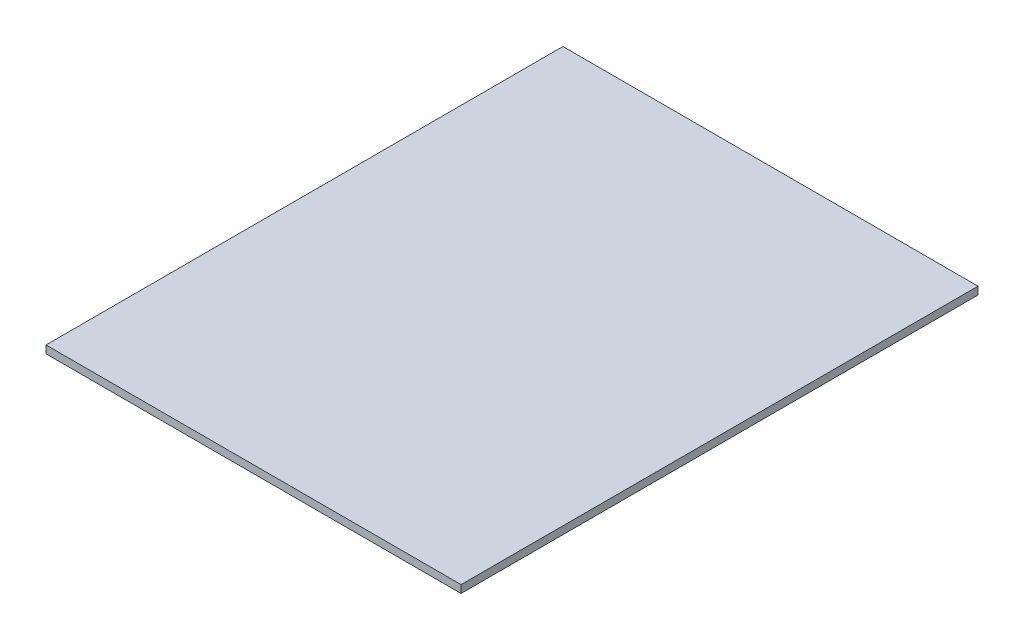
ISO-10303-21;
HEADER;
FILE_DESCRIPTION(('STEP AP214'),'2;1');
FILE_NAME('part.step','',(''),(''),'','','');
FILE_SCHEMA(('AUTOMOTIVE_DESIGN { 1 0 10303 214 1 1 1 1 }'));
ENDSEC;
DATA;
#1=APPLICATION_CONTEXT('core data for automotive mechanical design processes');
#2=APPLICATION_PROTOCOL_DEFINITION('international standard','automotive_design',2000,#1);
#3=PRODUCT_CONTEXT('',#1,'mechanical');
#4=PRODUCT('Part','Part','',(#3));
#5=PRODUCT_RELATED_PRODUCT_CATEGORY('part','',(#4));
#6=PRODUCT_DEFINITION_FORMATION('','',#4);
#7=PRODUCT_DEFINITION_CONTEXT('part definition',#1,'design');
#8=PRODUCT_DEFINITION('design','',#6,#7);
#9=PRODUCT_DEFINITION_SHAPE('','',#8);
#10=(LENGTH_UNIT() NAMED_UNIT(*) SI_UNIT(.MILLI.,.METRE.));
#11=(NAMED_UNIT(*) PLANE_ANGLE_UNIT() SI_UNIT($,.RADIAN.));
#12=(NAMED_UNIT(*) SI_UNIT($,.STERADIAN.) SOLID_ANGLE_UNIT());
#13=UNCERTAINTY_MEASURE_WITH_UNIT(LENGTH_MEASURE(1.E-05),#10,'distance_accuracy_value','');
#14=(GEOMETRIC_REPRESENTATION_CONTEXT(3) GLOBAL_UNCERTAINTY_ASSIGNED_CONTEXT((#13)) GLOBAL_UNIT_ASSIGNED_CONTEXT((#10,
#11,#12)) REPRESENTATION_CONTEXT('',''));
#15=CARTESIAN_POINT('',(0.,0.,0.));
#16=DIRECTION('',(0.,0.,1.));
#17=DIRECTION('',(1.,0.,0.));
#18=AXIS2_PLACEMENT_3D('',#15,#16,#17);
#19=CARTESIAN_POINT('',(0.,1.74,0.));
#20=DIRECTION('',(1.,0.,0.));
#21=DIRECTION('',(0.,0.,-1.));
#22=AXIS2_PLACEMENT_3D('',#19,#20,#21);
#23=PLANE('',#22);
#24=DIRECTION('',(0.,0.,1.));
#25=VECTOR('',#24,1.);
#26=CARTESIAN_POINT('',(0.,0.,0.));
#27=LINE('',#26,#25);
#28=CARTESIAN_POINT('',(0.,0.,-117.));
#29=VERTEX_POINT('',#28);
#30=CARTESIAN_POINT('',(0.,0.,0.));
#31=VERTEX_POINT('',#30);
#32=EDGE_CURVE('E98',#29,#31,#27,.T.);
#33=ORIENTED_EDGE('',*,*,#32,.T.);
#34=DIRECTION('',(0.,-1.,0.));
#35=VECTOR('',#34,1.);
#36=CARTESIAN_POINT('',(0.,1.74,0.));
#37=LINE('',#36,#35);
#38=CARTESIAN_POINT('',(0.,1.74,0.));
#39=VERTEX_POINT('',#38);
#40=EDGE_CURVE('E11',#39,#31,#37,.T.);
#41=ORIENTED_EDGE('',*,*,#40,.F.);
#42=DIRECTION('',(0.,0.,1.));
#43=VECTOR('',#42,1.);
#44=CARTESIAN_POINT('',(0.,1.74,0.));
#45=LINE('',#44,#43);
#46=CARTESIAN_POINT('',(0.,1.74,-117.));
#47=VERTEX_POINT('',#46);
#48=EDGE_CURVE('E86',#47,#39,#45,.T.);
#49=ORIENTED_EDGE('',*,*,#48,.F.);
#50=DIRECTION('',(0.,-1.,0.));
#51=VECTOR('',#50,1.);
#52=CARTESIAN_POINT('',(0.,1.74,-117.));
#53=LINE('',#52,#51);
#54=EDGE_CURVE('E94',#47,#29,#53,.T.);
#55=ORIENTED_EDGE('',*,*,#54,.T.);
#56=EDGE_LOOP('',(#33,#41,#49,#55));
#57=FACE_BOUND('',#56,.T.);
#58=ADVANCED_FACE('F35',(#57),#23,.F.);
#59=CARTESIAN_POINT('',(0.,1.74,0.));
#60=DIRECTION('',(0.,0.,-1.));
#61=DIRECTION('',(-1.,0.,0.));
#62=AXIS2_PLACEMENT_3D('',#59,#60,#61);
#63=PLANE('',#62);
#64=DIRECTION('',(1.,0.,0.));
#65=VECTOR('',#64,1.);
#66=CARTESIAN_POINT('',(0.,0.,0.));
#67=LINE('',#66,#65);
#68=CARTESIAN_POINT('',(93.95,0.,0.));
#69=VERTEX_POINT('',#68);
#70=EDGE_CURVE('E90',#31,#69,#67,.T.);
#71=ORIENTED_EDGE('',*,*,#70,.T.);
#72=DIRECTION('',(0.,-1.,0.));
#73=VECTOR('',#72,1.);
#74=CARTESIAN_POINT('',(93.95,1.74,0.));
#75=LINE('',#74,#73);
#76=CARTESIAN_POINT('',(93.95,1.74,0.));
#77=VERTEX_POINT('',#76);
#78=EDGE_CURVE('E43',#77,#69,#75,.T.);
#79=ORIENTED_EDGE('',*,*,#78,.F.);
#80=DIRECTION('',(1.,0.,0.));
#81=VECTOR('',#80,1.);
#82=CARTESIAN_POINT('',(0.,1.74,0.));
#83=LINE('',#82,#81);
#84=EDGE_CURVE('E81',#39,#77,#83,.T.);
#85=ORIENTED_EDGE('',*,*,#84,.F.);
#86=ORIENTED_EDGE('',*,*,#40,.T.);
#87=EDGE_LOOP('',(#71,#79,#85,#86));
#88=FACE_BOUND('',#87,.T.);
#89=ADVANCED_FACE('F89',(#88),#63,.F.);
#90=CARTESIAN_POINT('',(93.95,1.74,0.));
#91=DIRECTION('',(-1.,0.,0.));
#92=DIRECTION('',(0.,0.,1.));
#93=AXIS2_PLACEMENT_3D('',#90,#91,#92);
#94=PLANE('',#93);
#95=DIRECTION('',(0.,0.,-1.));
#96=VECTOR('',#95,1.);
#97=CARTESIAN_POINT('',(93.95,0.,0.));
#98=LINE('',#97,#96);
#99=CARTESIAN_POINT('',(93.95,0.,-117.));
#100=VERTEX_POINT('',#99);
#101=EDGE_CURVE('E68',#69,#100,#98,.T.);
#102=ORIENTED_EDGE('',*,*,#101,.T.);
#103=DIRECTION('',(0.,-1.,0.));
#104=VECTOR('',#103,1.);
#105=CARTESIAN_POINT('',(93.95,1.74,-117.));
#106=LINE('',#105,#104);
#107=CARTESIAN_POINT('',(93.95,1.74,-117.));
#108=VERTEX_POINT('',#107);
#109=EDGE_CURVE('E91',#108,#100,#106,.T.);
#110=ORIENTED_EDGE('',*,*,#109,.F.);
#111=DIRECTION('',(0.,0.,-1.));
#112=VECTOR('',#111,1.);
#113=CARTESIAN_POINT('',(93.95,1.74,0.));
#114=LINE('',#113,#112);
#115=EDGE_CURVE('E84',#77,#108,#114,.T.);
#116=ORIENTED_EDGE('',*,*,#115,.F.);
#117=ORIENTED_EDGE('',*,*,#78,.T.);
#118=EDGE_LOOP('',(#102,#110,#116,#117));
#119=FACE_BOUND('',#118,.T.);
#120=ADVANCED_FACE('F92',(#119),#94,.F.);
#121=CARTESIAN_POINT('',(0.,1.74,-117.));
#122=DIRECTION('',(0.,0.,1.));
#123=DIRECTION('',(1.,0.,0.));
#124=AXIS2_PLACEMENT_3D('',#121,#122,#123);
#125=PLANE('',#124);
#126=DIRECTION('',(-1.,0.,0.));
#127=VECTOR('',#126,1.);
#128=CARTESIAN_POINT('',(0.,0.,-117.));
#129=LINE('',#128,#127);
#130=EDGE_CURVE('E74',#100,#29,#129,.T.);
#131=ORIENTED_EDGE('',*,*,#130,.T.);
#132=ORIENTED_EDGE('',*,*,#54,.F.);
#133=DIRECTION('',(-1.,0.,0.));
#134=VECTOR('',#133,1.);
#135=CARTESIAN_POINT('',(0.,1.74,-117.));
#136=LINE('',#135,#134);
#137=EDGE_CURVE('E51',#108,#47,#136,.T.);
#138=ORIENTED_EDGE('',*,*,#137,.F.);
#139=ORIENTED_EDGE('',*,*,#109,.T.);
#140=EDGE_LOOP('',(#131,#132,#138,#139));
#141=FACE_BOUND('',#140,.T.);
#142=ADVANCED_FACE('F105',(#141),#125,.F.);
#143=CARTESIAN_POINT('',(0.,1.74,0.));
#144=DIRECTION('',(0.,-1.,0.));
#145=DIRECTION('',(0.,0.,-1.));
#146=AXIS2_PLACEMENT_3D('',#143,#144,#145);
#147=PLANE('',#146);
#148=ORIENTED_EDGE('',*,*,#48,.T.);
#149=ORIENTED_EDGE('',*,*,#84,.T.);
#150=ORIENTED_EDGE('',*,*,#115,.T.);
#151=ORIENTED_EDGE('',*,*,#137,.T.);
#152=EDGE_LOOP('',(#148,#149,#150,#151));
#153=FACE_BOUND('',#152,.T.);
#154=ADVANCED_FACE('F82',(#153),#147,.F.);
#155=CARTESIAN_POINT('',(0.,0.,0.));
#156=DIRECTION('',(0.,-1.,0.));
#157=DIRECTION('',(0.,0.,-1.));
#158=AXIS2_PLACEMENT_3D('',#155,#156,#157);
#159=PLANE('',#158);
#160=ORIENTED_EDGE('',*,*,#32,.F.);
#161=ORIENTED_EDGE('',*,*,#130,.F.);
#162=ORIENTED_EDGE('',*,*,#101,.F.);
#163=ORIENTED_EDGE('',*,*,#70,.F.);
#164=EDGE_LOOP('',(#160,#161,#162,#163));
#165=FACE_BOUND('',#164,.T.);
#166=ADVANCED_FACE('F108',(#165),#159,.T.);
#167=CLOSED_SHELL('',(#58,#89,#120,#142,#154,#166));
#168=MANIFOLD_SOLID_BREP('B2',#167);
#169=ADVANCED_BREP_SHAPE_REPRESENTATION('',(#18,#168),#14);
#170=SHAPE_DEFINITION_REPRESENTATION(#9,#169);
ENDSEC;
END-ISO-10303-21;
